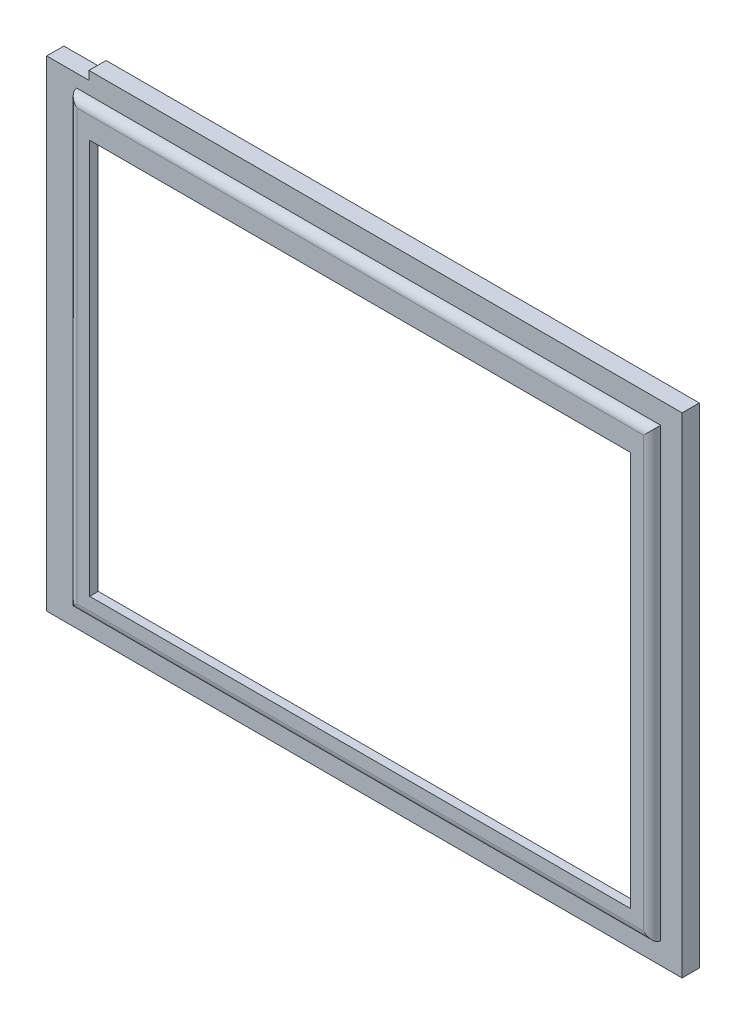
ISO-10303-21;
HEADER;
FILE_DESCRIPTION(('STEP AP214'),'2;1');
FILE_NAME('part.step','',(''),(''),'','','');
FILE_SCHEMA(('AUTOMOTIVE_DESIGN { 1 0 10303 214 1 1 1 1 }'));
ENDSEC;
DATA;
#1=APPLICATION_CONTEXT('core data for automotive mechanical design processes');
#2=APPLICATION_PROTOCOL_DEFINITION('international standard','automotive_design',2000,#1);
#3=PRODUCT_CONTEXT('',#1,'mechanical');
#4=PRODUCT('Part','Part','',(#3));
#5=PRODUCT_RELATED_PRODUCT_CATEGORY('part','',(#4));
#6=PRODUCT_DEFINITION_FORMATION('','',#4);
#7=PRODUCT_DEFINITION_CONTEXT('part definition',#1,'design');
#8=PRODUCT_DEFINITION('design','',#6,#7);
#9=PRODUCT_DEFINITION_SHAPE('','',#8);
#10=(LENGTH_UNIT() NAMED_UNIT(*) SI_UNIT(.MILLI.,.METRE.));
#11=(NAMED_UNIT(*) PLANE_ANGLE_UNIT() SI_UNIT($,.RADIAN.));
#12=(NAMED_UNIT(*) SI_UNIT($,.STERADIAN.) SOLID_ANGLE_UNIT());
#13=UNCERTAINTY_MEASURE_WITH_UNIT(LENGTH_MEASURE(1.E-05),#10,'distance_accuracy_value','');
#14=(GEOMETRIC_REPRESENTATION_CONTEXT(3) GLOBAL_UNCERTAINTY_ASSIGNED_CONTEXT((#13)) GLOBAL_UNIT_ASSIGNED_CONTEXT((#10,
#11,#12)) REPRESENTATION_CONTEXT('',''));
#15=CARTESIAN_POINT('',(0.,0.,0.));
#16=DIRECTION('',(0.,0.,1.));
#17=DIRECTION('',(1.,0.,0.));
#18=AXIS2_PLACEMENT_3D('',#15,#16,#17);
#19=CARTESIAN_POINT('',(0.,-535.,20.));
#20=DIRECTION('',(-1.,0.,0.));
#21=DIRECTION('',(0.,0.,1.));
#22=AXIS2_PLACEMENT_3D('',#19,#20,#21);
#23=CYLINDRICAL_SURFACE('',#22,10.);
#24=CARTESIAN_POINT('',(705.,-535.,20.));
#25=DIRECTION('',(-0.707106781186547,-0.707106781186548,0.));
#26=DIRECTION('',(0.707106781186548,-0.707106781186547,0.));
#27=AXIS2_PLACEMENT_3D('',#24,#25,#26);
#28=ELLIPSE('',#27,14.142135623731,10.);
#29=CARTESIAN_POINT('',(705.,-535.,30.));
#30=VERTEX_POINT('',#29);
#31=CARTESIAN_POINT('',(715.,-545.,20.));
#32=VERTEX_POINT('',#31);
#33=EDGE_CURVE('E12',#30,#32,#28,.F.);
#34=ORIENTED_EDGE('',*,*,#33,.F.);
#35=DIRECTION('',(1.,0.,0.));
#36=VECTOR('',#35,1.);
#37=CARTESIAN_POINT('',(0.,-535.,30.));
#38=LINE('',#37,#36);
#39=CARTESIAN_POINT('',(45.0000000000001,-535.,30.));
#40=VERTEX_POINT('',#39);
#41=EDGE_CURVE('E161',#40,#30,#38,.T.);
#42=ORIENTED_EDGE('',*,*,#41,.F.);
#43=CARTESIAN_POINT('',(45.0000000000001,-535.,20.));
#44=DIRECTION('',(-0.707106781186548,0.707106781186547,0.));
#45=DIRECTION('',(-0.707106781186547,-0.707106781186548,0.));
#46=AXIS2_PLACEMENT_3D('',#43,#44,#45);
#47=ELLIPSE('',#46,14.1421356237309,10.);
#48=CARTESIAN_POINT('',(35.0000000000001,-545.,20.));
#49=VERTEX_POINT('',#48);
#50=EDGE_CURVE('E51',#40,#49,#47,.F.);
#51=ORIENTED_EDGE('',*,*,#50,.T.);
#52=DIRECTION('',(1.,0.,0.));
#53=VECTOR('',#52,1.);
#54=CARTESIAN_POINT('',(35.0000000000001,-545.,20.));
#55=LINE('',#54,#53);
#56=EDGE_CURVE('E154',#49,#32,#55,.T.);
#57=ORIENTED_EDGE('',*,*,#56,.T.);
#58=EDGE_LOOP('',(#34,#42,#51,#57));
#59=FACE_BOUND('',#58,.T.);
#60=ADVANCED_FACE('F44',(#59),#23,.T.);
#61=CARTESIAN_POINT('',(45.,0.,20.));
#62=DIRECTION('',(0.,1.,0.));
#63=DIRECTION('',(-1.,0.,0.));
#64=AXIS2_PLACEMENT_3D('',#61,#62,#63);
#65=CYLINDRICAL_SURFACE('',#64,10.);
#66=ORIENTED_EDGE('',*,*,#50,.F.);
#67=DIRECTION('',(0.,-1.,0.));
#68=VECTOR('',#67,1.);
#69=CARTESIAN_POINT('',(45.,0.,30.));
#70=LINE('',#69,#68);
#71=CARTESIAN_POINT('',(45.,-35.,30.));
#72=VERTEX_POINT('',#71);
#73=EDGE_CURVE('E164',#72,#40,#70,.T.);
#74=ORIENTED_EDGE('',*,*,#73,.F.);
#75=CARTESIAN_POINT('',(45.,-35.,20.));
#76=DIRECTION('',(0.707106781186547,0.707106781186548,0.));
#77=DIRECTION('',(-0.707106781186548,0.707106781186547,0.));
#78=AXIS2_PLACEMENT_3D('',#75,#76,#77);
#79=ELLIPSE('',#78,14.142135623731,10.);
#80=CARTESIAN_POINT('',(35.,-25.,20.));
#81=VERTEX_POINT('',#80);
#82=EDGE_CURVE('E66',#72,#81,#79,.F.);
#83=ORIENTED_EDGE('',*,*,#82,.T.);
#84=DIRECTION('',(0.,-1.,0.));
#85=VECTOR('',#84,1.);
#86=CARTESIAN_POINT('',(35.,-25.,20.));
#87=LINE('',#86,#85);
#88=EDGE_CURVE('E128',#81,#49,#87,.T.);
#89=ORIENTED_EDGE('',*,*,#88,.T.);
#90=EDGE_LOOP('',(#66,#74,#83,#89));
#91=FACE_BOUND('',#90,.T.);
#92=ADVANCED_FACE('F183',(#91),#65,.T.);
#93=CARTESIAN_POINT('',(0.,-35.,20.));
#94=DIRECTION('',(1.,0.,0.));
#95=DIRECTION('',(0.,1.,0.));
#96=AXIS2_PLACEMENT_3D('',#93,#94,#95);
#97=CYLINDRICAL_SURFACE('',#96,10.);
#98=ORIENTED_EDGE('',*,*,#82,.F.);
#99=DIRECTION('',(-1.,0.,0.));
#100=VECTOR('',#99,1.);
#101=CARTESIAN_POINT('',(0.,-35.,30.));
#102=LINE('',#101,#100);
#103=CARTESIAN_POINT('',(705.,-35.,30.));
#104=VERTEX_POINT('',#103);
#105=EDGE_CURVE('E167',#104,#72,#102,.T.);
#106=ORIENTED_EDGE('',*,*,#105,.F.);
#107=CARTESIAN_POINT('',(705.,-35.,20.));
#108=DIRECTION('',(0.707106781186548,-0.707106781186547,0.));
#109=DIRECTION('',(0.707106781186547,0.707106781186548,0.));
#110=AXIS2_PLACEMENT_3D('',#107,#108,#109);
#111=ELLIPSE('',#110,14.1421356237309,10.);
#112=CARTESIAN_POINT('',(715.,-25.,20.));
#113=VERTEX_POINT('',#112);
#114=EDGE_CURVE('E58',#104,#113,#111,.F.);
#115=ORIENTED_EDGE('',*,*,#114,.T.);
#116=DIRECTION('',(-1.,0.,0.));
#117=VECTOR('',#116,1.);
#118=CARTESIAN_POINT('',(35.,-25.,20.));
#119=LINE('',#118,#117);
#120=EDGE_CURVE('E159',#113,#81,#119,.T.);
#121=ORIENTED_EDGE('',*,*,#120,.T.);
#122=EDGE_LOOP('',(#98,#106,#115,#121));
#123=FACE_BOUND('',#122,.T.);
#124=ADVANCED_FACE('F184',(#123),#97,.T.);
#125=CARTESIAN_POINT('',(705.,1.50520621607834E-13,20.));
#126=DIRECTION('',(0.,-1.,0.));
#127=DIRECTION('',(1.,0.,0.));
#128=AXIS2_PLACEMENT_3D('',#125,#126,#127);
#129=CYLINDRICAL_SURFACE('',#128,10.);
#130=DIRECTION('',(0.,1.,0.));
#131=VECTOR('',#130,1.);
#132=CARTESIAN_POINT('',(705.,1.50520621607834E-13,30.));
#133=LINE('',#132,#131);
#134=EDGE_CURVE('E169',#30,#104,#133,.T.);
#135=ORIENTED_EDGE('',*,*,#134,.F.);
#136=ORIENTED_EDGE('',*,*,#33,.T.);
#137=DIRECTION('',(0.,1.,0.));
#138=VECTOR('',#137,1.);
#139=CARTESIAN_POINT('',(715.,-25.,20.));
#140=LINE('',#139,#138);
#141=EDGE_CURVE('E157',#32,#113,#140,.T.);
#142=ORIENTED_EDGE('',*,*,#141,.T.);
#143=ORIENTED_EDGE('',*,*,#114,.F.);
#144=EDGE_LOOP('',(#135,#136,#142,#143));
#145=FACE_BOUND('',#144,.T.);
#146=ADVANCED_FACE('F185',(#145),#129,.T.);
#147=CARTESIAN_POINT('',(0.,0.,30.));
#148=DIRECTION('',(0.,0.,1.));
#149=DIRECTION('',(1.,0.,0.));
#150=AXIS2_PLACEMENT_3D('',#147,#148,#149);
#151=PLANE('',#150);
#152=ORIENTED_EDGE('',*,*,#41,.T.);
#153=ORIENTED_EDGE('',*,*,#134,.T.);
#154=ORIENTED_EDGE('',*,*,#105,.T.);
#155=ORIENTED_EDGE('',*,*,#73,.T.);
#156=EDGE_LOOP('',(#152,#153,#154,#155));
#157=FACE_BOUND('',#156,.T.);
#158=DIRECTION('',(1.,0.,0.));
#159=VECTOR('',#158,1.);
#160=CARTESIAN_POINT('',(60.0000000000001,-520.,30.));
#161=LINE('',#160,#159);
#162=CARTESIAN_POINT('',(60.0000000000001,-520.,30.));
#163=VERTEX_POINT('',#162);
#164=CARTESIAN_POINT('',(690.,-520.,30.));
#165=VERTEX_POINT('',#164);
#166=EDGE_CURVE('E120',#163,#165,#161,.T.);
#167=ORIENTED_EDGE('',*,*,#166,.F.);
#168=DIRECTION('',(0.,-1.,0.));
#169=VECTOR('',#168,1.);
#170=CARTESIAN_POINT('',(60.0000000000001,-520.,30.));
#171=LINE('',#170,#169);
#172=CARTESIAN_POINT('',(60.0000000000001,-60.,30.));
#173=VERTEX_POINT('',#172);
#174=EDGE_CURVE('E110',#173,#163,#171,.T.);
#175=ORIENTED_EDGE('',*,*,#174,.F.);
#176=DIRECTION('',(-1.,0.,0.));
#177=VECTOR('',#176,1.);
#178=CARTESIAN_POINT('',(60.0000000000001,-60.,30.));
#179=LINE('',#178,#177);
#180=CARTESIAN_POINT('',(690.,-60.,30.));
#181=VERTEX_POINT('',#180);
#182=EDGE_CURVE('E136',#181,#173,#179,.T.);
#183=ORIENTED_EDGE('',*,*,#182,.F.);
#184=DIRECTION('',(0.,1.,0.));
#185=VECTOR('',#184,1.);
#186=CARTESIAN_POINT('',(690.,-520.,30.));
#187=LINE('',#186,#185);
#188=EDGE_CURVE('E134',#165,#181,#187,.T.);
#189=ORIENTED_EDGE('',*,*,#188,.F.);
#190=EDGE_LOOP('',(#167,#175,#183,#189));
#191=FACE_BOUND('',#190,.T.);
#192=ADVANCED_FACE('F132',(#157,#191),#151,.T.);
#193=CARTESIAN_POINT('',(0.,0.,20.));
#194=DIRECTION('',(0.,0.,1.));
#195=DIRECTION('',(1.,0.,0.));
#196=AXIS2_PLACEMENT_3D('',#193,#194,#195);
#197=PLANE('',#196);
#198=ORIENTED_EDGE('',*,*,#88,.F.);
#199=ORIENTED_EDGE('',*,*,#120,.F.);
#200=ORIENTED_EDGE('',*,*,#141,.F.);
#201=ORIENTED_EDGE('',*,*,#56,.F.);
#202=EDGE_LOOP('',(#198,#199,#200,#201));
#203=FACE_BOUND('',#202,.T.);
#204=DIRECTION('',(0.,-1.,0.));
#205=VECTOR('',#204,1.);
#206=CARTESIAN_POINT('',(60.0000000000001,-520.,20.));
#207=LINE('',#206,#205);
#208=CARTESIAN_POINT('',(60.0000000000001,-60.,20.));
#209=VERTEX_POINT('',#208);
#210=CARTESIAN_POINT('',(60.0000000000001,-520.,20.));
#211=VERTEX_POINT('',#210);
#212=EDGE_CURVE('E140',#209,#211,#207,.T.);
#213=ORIENTED_EDGE('',*,*,#212,.T.);
#214=DIRECTION('',(1.,0.,0.));
#215=VECTOR('',#214,1.);
#216=CARTESIAN_POINT('',(60.0000000000001,-520.,20.));
#217=LINE('',#216,#215);
#218=CARTESIAN_POINT('',(690.,-520.,20.));
#219=VERTEX_POINT('',#218);
#220=EDGE_CURVE('E127',#211,#219,#217,.T.);
#221=ORIENTED_EDGE('',*,*,#220,.T.);
#222=DIRECTION('',(0.,1.,0.));
#223=VECTOR('',#222,1.);
#224=CARTESIAN_POINT('',(690.,-520.,20.));
#225=LINE('',#224,#223);
#226=CARTESIAN_POINT('',(690.,-60.,20.));
#227=VERTEX_POINT('',#226);
#228=EDGE_CURVE('E143',#219,#227,#225,.T.);
#229=ORIENTED_EDGE('',*,*,#228,.T.);
#230=DIRECTION('',(-1.,0.,0.));
#231=VECTOR('',#230,1.);
#232=CARTESIAN_POINT('',(60.0000000000001,-60.,20.));
#233=LINE('',#232,#231);
#234=EDGE_CURVE('E121',#227,#209,#233,.T.);
#235=ORIENTED_EDGE('',*,*,#234,.T.);
#236=EDGE_LOOP('',(#213,#221,#229,#235));
#237=FACE_BOUND('',#236,.T.);
#238=ADVANCED_FACE('F180',(#203,#237),#197,.F.);
#239=CARTESIAN_POINT('',(60.0000000000001,-520.,30.));
#240=DIRECTION('',(1.,0.,0.));
#241=DIRECTION('',(0.,0.,-1.));
#242=AXIS2_PLACEMENT_3D('',#239,#240,#241);
#243=PLANE('',#242);
#244=ORIENTED_EDGE('',*,*,#212,.F.);
#245=DIRECTION('',(0.,0.,-1.));
#246=VECTOR('',#245,1.);
#247=CARTESIAN_POINT('',(60.0000000000001,-60.,30.));
#248=LINE('',#247,#246);
#249=EDGE_CURVE('E116',#173,#209,#248,.T.);
#250=ORIENTED_EDGE('',*,*,#249,.F.);
#251=ORIENTED_EDGE('',*,*,#174,.T.);
#252=DIRECTION('',(0.,0.,-1.));
#253=VECTOR('',#252,1.);
#254=CARTESIAN_POINT('',(60.0000000000001,-520.,30.));
#255=LINE('',#254,#253);
#256=EDGE_CURVE('E113',#163,#211,#255,.T.);
#257=ORIENTED_EDGE('',*,*,#256,.T.);
#258=EDGE_LOOP('',(#244,#250,#251,#257));
#259=FACE_BOUND('',#258,.T.);
#260=ADVANCED_FACE('F112',(#259),#243,.T.);
#261=CARTESIAN_POINT('',(60.0000000000001,-520.,30.));
#262=DIRECTION('',(0.,1.,0.));
#263=DIRECTION('',(0.,0.,1.));
#264=AXIS2_PLACEMENT_3D('',#261,#262,#263);
#265=PLANE('',#264);
#266=ORIENTED_EDGE('',*,*,#220,.F.);
#267=ORIENTED_EDGE('',*,*,#256,.F.);
#268=ORIENTED_EDGE('',*,*,#166,.T.);
#269=DIRECTION('',(0.,0.,-1.));
#270=VECTOR('',#269,1.);
#271=CARTESIAN_POINT('',(690.,-520.,30.));
#272=LINE('',#271,#270);
#273=EDGE_CURVE('E129',#165,#219,#272,.T.);
#274=ORIENTED_EDGE('',*,*,#273,.T.);
#275=EDGE_LOOP('',(#266,#267,#268,#274));
#276=FACE_BOUND('',#275,.T.);
#277=ADVANCED_FACE('F124',(#276),#265,.T.);
#278=CARTESIAN_POINT('',(690.,-520.,30.));
#279=DIRECTION('',(-1.,0.,0.));
#280=DIRECTION('',(0.,-1.,0.));
#281=AXIS2_PLACEMENT_3D('',#278,#279,#280);
#282=PLANE('',#281);
#283=ORIENTED_EDGE('',*,*,#228,.F.);
#284=ORIENTED_EDGE('',*,*,#273,.F.);
#285=ORIENTED_EDGE('',*,*,#188,.T.);
#286=DIRECTION('',(0.,0.,-1.));
#287=VECTOR('',#286,1.);
#288=CARTESIAN_POINT('',(690.,-60.,30.));
#289=LINE('',#288,#287);
#290=EDGE_CURVE('E149',#181,#227,#289,.T.);
#291=ORIENTED_EDGE('',*,*,#290,.T.);
#292=EDGE_LOOP('',(#283,#284,#285,#291));
#293=FACE_BOUND('',#292,.T.);
#294=ADVANCED_FACE('F235',(#293),#282,.T.);
#295=CARTESIAN_POINT('',(60.0000000000001,-60.,30.));
#296=DIRECTION('',(0.,-1.,0.));
#297=DIRECTION('',(1.,0.,0.));
#298=AXIS2_PLACEMENT_3D('',#295,#296,#297);
#299=PLANE('',#298);
#300=ORIENTED_EDGE('',*,*,#234,.F.);
#301=ORIENTED_EDGE('',*,*,#290,.F.);
#302=ORIENTED_EDGE('',*,*,#182,.T.);
#303=ORIENTED_EDGE('',*,*,#249,.T.);
#304=EDGE_LOOP('',(#300,#301,#302,#303));
#305=FACE_BOUND('',#304,.T.);
#306=ADVANCED_FACE('F243',(#305),#299,.T.);
#307=CLOSED_SHELL('',(#60,#92,#124,#146,#192,#238,#260,#277,#294,#306));
#308=MANIFOLD_SOLID_BREP('B2',#307);
#309=CARTESIAN_POINT('',(0.,0.,20.));
#310=DIRECTION('',(0.,0.,1.));
#311=DIRECTION('',(1.,0.,0.));
#312=AXIS2_PLACEMENT_3D('',#309,#310,#311);
#313=PLANE('',#312);
#314=DIRECTION('',(0.,1.,0.));
#315=VECTOR('',#314,1.);
#316=CARTESIAN_POINT('',(49.143238,0.,20.));
#317=LINE('',#316,#315);
#318=CARTESIAN_POINT('',(49.143238,-10.,20.));
#319=VERTEX_POINT('',#318);
#320=CARTESIAN_POINT('',(49.143238,0.,20.));
#321=VERTEX_POINT('',#320);
#322=EDGE_CURVE('E288',#319,#321,#317,.T.);
#323=ORIENTED_EDGE('',*,*,#322,.F.);
#324=DIRECTION('',(1.,0.,0.));
#325=VECTOR('',#324,1.);
#326=CARTESIAN_POINT('',(0.,-10.,20.));
#327=LINE('',#326,#325);
#328=CARTESIAN_POINT('',(0.,-10.,20.));
#329=VERTEX_POINT('',#328);
#330=EDGE_CURVE('E438',#329,#319,#327,.T.);
#331=ORIENTED_EDGE('',*,*,#330,.F.);
#332=DIRECTION('',(0.,-1.,0.));
#333=VECTOR('',#332,1.);
#334=CARTESIAN_POINT('',(0.,0.,20.));
#335=LINE('',#334,#333);
#336=CARTESIAN_POINT('',(0.,-570.,20.));
#337=VERTEX_POINT('',#336);
#338=EDGE_CURVE('E368',#329,#337,#335,.T.);
#339=ORIENTED_EDGE('',*,*,#338,.T.);
#340=DIRECTION('',(1.,0.,0.));
#341=VECTOR('',#340,1.);
#342=CARTESIAN_POINT('',(0.,-570.,20.));
#343=LINE('',#342,#341);
#344=CARTESIAN_POINT('',(740.,-570.,20.));
#345=VERTEX_POINT('',#344);
#346=EDGE_CURVE('E407',#337,#345,#343,.T.);
#347=ORIENTED_EDGE('',*,*,#346,.T.);
#348=DIRECTION('',(0.,1.,0.));
#349=VECTOR('',#348,1.);
#350=CARTESIAN_POINT('',(740.,-570.,20.));
#351=LINE('',#350,#349);
#352=CARTESIAN_POINT('',(740.,0.,20.));
#353=VERTEX_POINT('',#352);
#354=EDGE_CURVE('E397',#345,#353,#351,.T.);
#355=ORIENTED_EDGE('',*,*,#354,.T.);
#356=DIRECTION('',(-1.,0.,0.));
#357=VECTOR('',#356,1.);
#358=CARTESIAN_POINT('',(0.,0.,20.));
#359=LINE('',#358,#357);
#360=EDGE_CURVE('E382',#353,#321,#359,.T.);
#361=ORIENTED_EDGE('',*,*,#360,.T.);
#362=EDGE_LOOP('',(#323,#331,#339,#347,#355,#361));
#363=FACE_BOUND('',#362,.T.);
#364=DIRECTION('',(1.,0.,0.));
#365=VECTOR('',#364,1.);
#366=CARTESIAN_POINT('',(35.0000000000001,-545.,20.));
#367=LINE('',#366,#365);
#368=CARTESIAN_POINT('',(35.0000000000001,-545.,20.));
#369=VERTEX_POINT('',#368);
#370=CARTESIAN_POINT('',(715.,-545.,20.));
#371=VERTEX_POINT('',#370);
#372=EDGE_CURVE('E432',#369,#371,#367,.T.);
#373=ORIENTED_EDGE('',*,*,#372,.F.);
#374=DIRECTION('',(0.,-1.,0.));
#375=VECTOR('',#374,1.);
#376=CARTESIAN_POINT('',(35.,-25.,20.));
#377=LINE('',#376,#375);
#378=CARTESIAN_POINT('',(35.,-25.,20.));
#379=VERTEX_POINT('',#378);
#380=EDGE_CURVE('E420',#379,#369,#377,.T.);
#381=ORIENTED_EDGE('',*,*,#380,.F.);
#382=DIRECTION('',(-1.,0.,0.));
#383=VECTOR('',#382,1.);
#384=CARTESIAN_POINT('',(35.,-25.,20.));
#385=LINE('',#384,#383);
#386=CARTESIAN_POINT('',(715.,-25.,20.));
#387=VERTEX_POINT('',#386);
#388=EDGE_CURVE('E416',#387,#379,#385,.T.);
#389=ORIENTED_EDGE('',*,*,#388,.F.);
#390=DIRECTION('',(0.,1.,0.));
#391=VECTOR('',#390,1.);
#392=CARTESIAN_POINT('',(715.,-25.,20.));
#393=LINE('',#392,#391);
#394=EDGE_CURVE('E430',#371,#387,#393,.T.);
#395=ORIENTED_EDGE('',*,*,#394,.F.);
#396=EDGE_LOOP('',(#373,#381,#389,#395));
#397=FACE_BOUND('',#396,.T.);
#398=ADVANCED_FACE('F273',(#363,#397),#313,.T.);
#399=CARTESIAN_POINT('',(0.,0.,0.));
#400=DIRECTION('',(0.,0.,1.));
#401=DIRECTION('',(1.,0.,0.));
#402=AXIS2_PLACEMENT_3D('',#399,#400,#401);
#403=PLANE('',#402);
#404=DIRECTION('',(-1.,0.,0.));
#405=VECTOR('',#404,1.);
#406=CARTESIAN_POINT('',(0.,-10.,0.));
#407=LINE('',#406,#405);
#408=CARTESIAN_POINT('',(49.143238,-10.,0.));
#409=VERTEX_POINT('',#408);
#410=CARTESIAN_POINT('',(0.,-10.,0.));
#411=VERTEX_POINT('',#410);
#412=EDGE_CURVE('E349',#409,#411,#407,.T.);
#413=ORIENTED_EDGE('',*,*,#412,.F.);
#414=DIRECTION('',(0.,-1.,0.));
#415=VECTOR('',#414,1.);
#416=CARTESIAN_POINT('',(49.143238,0.,0.));
#417=LINE('',#416,#415);
#418=CARTESIAN_POINT('',(49.143238,0.,0.));
#419=VERTEX_POINT('',#418);
#420=EDGE_CURVE('E401',#419,#409,#417,.T.);
#421=ORIENTED_EDGE('',*,*,#420,.F.);
#422=DIRECTION('',(-1.,0.,0.));
#423=VECTOR('',#422,1.);
#424=CARTESIAN_POINT('',(0.,0.,0.));
#425=LINE('',#424,#423);
#426=CARTESIAN_POINT('',(740.,0.,0.));
#427=VERTEX_POINT('',#426);
#428=EDGE_CURVE('E386',#427,#419,#425,.T.);
#429=ORIENTED_EDGE('',*,*,#428,.F.);
#430=DIRECTION('',(0.,1.,0.));
#431=VECTOR('',#430,1.);
#432=CARTESIAN_POINT('',(740.,-570.,0.));
#433=LINE('',#432,#431);
#434=CARTESIAN_POINT('',(740.,-570.,0.));
#435=VERTEX_POINT('',#434);
#436=EDGE_CURVE('E376',#435,#427,#433,.T.);
#437=ORIENTED_EDGE('',*,*,#436,.F.);
#438=DIRECTION('',(1.,0.,0.));
#439=VECTOR('',#438,1.);
#440=CARTESIAN_POINT('',(0.,-570.,0.));
#441=LINE('',#440,#439);
#442=CARTESIAN_POINT('',(0.,-570.,0.));
#443=VERTEX_POINT('',#442);
#444=EDGE_CURVE('E373',#443,#435,#441,.T.);
#445=ORIENTED_EDGE('',*,*,#444,.F.);
#446=DIRECTION('',(0.,-1.,0.));
#447=VECTOR('',#446,1.);
#448=CARTESIAN_POINT('',(0.,0.,0.));
#449=LINE('',#448,#447);
#450=EDGE_CURVE('E366',#411,#443,#449,.T.);
#451=ORIENTED_EDGE('',*,*,#450,.F.);
#452=EDGE_LOOP('',(#413,#421,#429,#437,#445,#451));
#453=FACE_BOUND('',#452,.T.);
#454=DIRECTION('',(0.,-1.,0.));
#455=VECTOR('',#454,1.);
#456=CARTESIAN_POINT('',(35.,-25.,0.));
#457=LINE('',#456,#455);
#458=CARTESIAN_POINT('',(35.,-25.,0.));
#459=VERTEX_POINT('',#458);
#460=CARTESIAN_POINT('',(35.0000000000001,-545.,0.));
#461=VERTEX_POINT('',#460);
#462=EDGE_CURVE('E360',#459,#461,#457,.T.);
#463=ORIENTED_EDGE('',*,*,#462,.T.);
#464=DIRECTION('',(1.,0.,0.));
#465=VECTOR('',#464,1.);
#466=CARTESIAN_POINT('',(35.0000000000001,-545.,0.));
#467=LINE('',#466,#465);
#468=CARTESIAN_POINT('',(715.,-545.,0.));
#469=VERTEX_POINT('',#468);
#470=EDGE_CURVE('E424',#461,#469,#467,.T.);
#471=ORIENTED_EDGE('',*,*,#470,.T.);
#472=DIRECTION('',(0.,1.,0.));
#473=VECTOR('',#472,1.);
#474=CARTESIAN_POINT('',(715.,-25.,0.));
#475=LINE('',#474,#473);
#476=CARTESIAN_POINT('',(715.,-25.,0.));
#477=VERTEX_POINT('',#476);
#478=EDGE_CURVE('E421',#469,#477,#475,.T.);
#479=ORIENTED_EDGE('',*,*,#478,.T.);
#480=DIRECTION('',(-1.,0.,0.));
#481=VECTOR('',#480,1.);
#482=CARTESIAN_POINT('',(35.,-25.,0.));
#483=LINE('',#482,#481);
#484=EDGE_CURVE('E417',#477,#459,#483,.T.);
#485=ORIENTED_EDGE('',*,*,#484,.T.);
#486=EDGE_LOOP('',(#463,#471,#479,#485));
#487=FACE_BOUND('',#486,.T.);
#488=ADVANCED_FACE('F370',(#453,#487),#403,.F.);
#489=CARTESIAN_POINT('',(0.,0.,20.));
#490=DIRECTION('',(1.,0.,0.));
#491=DIRECTION('',(0.,1.,0.));
#492=AXIS2_PLACEMENT_3D('',#489,#490,#491);
#493=PLANE('',#492);
#494=ORIENTED_EDGE('',*,*,#338,.F.);
#495=DIRECTION('',(0.,0.,1.));
#496=VECTOR('',#495,1.);
#497=CARTESIAN_POINT('',(0.,-10.,-0.001000000000001));
#498=LINE('',#497,#496);
#499=EDGE_CURVE('E353',#411,#329,#498,.T.);
#500=ORIENTED_EDGE('',*,*,#499,.F.);
#501=ORIENTED_EDGE('',*,*,#450,.T.);
#502=DIRECTION('',(0.,0.,-1.));
#503=VECTOR('',#502,1.);
#504=CARTESIAN_POINT('',(0.,-570.,20.));
#505=LINE('',#504,#503);
#506=EDGE_CURVE('E42',#337,#443,#505,.T.);
#507=ORIENTED_EDGE('',*,*,#506,.F.);
#508=EDGE_LOOP('',(#494,#500,#501,#507));
#509=FACE_BOUND('',#508,.T.);
#510=ADVANCED_FACE('F275',(#509),#493,.F.);
#511=CARTESIAN_POINT('',(0.,-570.,20.));
#512=DIRECTION('',(0.,1.,0.));
#513=DIRECTION('',(0.,0.,1.));
#514=AXIS2_PLACEMENT_3D('',#511,#512,#513);
#515=PLANE('',#514);
#516=ORIENTED_EDGE('',*,*,#444,.T.);
#517=DIRECTION('',(0.,0.,-1.));
#518=VECTOR('',#517,1.);
#519=CARTESIAN_POINT('',(740.,-570.,20.));
#520=LINE('',#519,#518);
#521=EDGE_CURVE('E281',#345,#435,#520,.T.);
#522=ORIENTED_EDGE('',*,*,#521,.F.);
#523=ORIENTED_EDGE('',*,*,#346,.F.);
#524=ORIENTED_EDGE('',*,*,#506,.T.);
#525=EDGE_LOOP('',(#516,#522,#523,#524));
#526=FACE_BOUND('',#525,.T.);
#527=ADVANCED_FACE('F478',(#526),#515,.F.);
#528=CARTESIAN_POINT('',(740.,-570.,20.));
#529=DIRECTION('',(-1.,0.,0.));
#530=DIRECTION('',(0.,-1.,0.));
#531=AXIS2_PLACEMENT_3D('',#528,#529,#530);
#532=PLANE('',#531);
#533=ORIENTED_EDGE('',*,*,#436,.T.);
#534=DIRECTION('',(0.,0.,-1.));
#535=VECTOR('',#534,1.);
#536=CARTESIAN_POINT('',(740.,0.,20.));
#537=LINE('',#536,#535);
#538=EDGE_CURVE('E389',#353,#427,#537,.T.);
#539=ORIENTED_EDGE('',*,*,#538,.F.);
#540=ORIENTED_EDGE('',*,*,#354,.F.);
#541=ORIENTED_EDGE('',*,*,#521,.T.);
#542=EDGE_LOOP('',(#533,#539,#540,#541));
#543=FACE_BOUND('',#542,.T.);
#544=ADVANCED_FACE('F395',(#543),#532,.F.);
#545=CARTESIAN_POINT('',(0.,0.,20.));
#546=DIRECTION('',(0.,-1.,0.));
#547=DIRECTION('',(0.,0.,-1.));
#548=AXIS2_PLACEMENT_3D('',#545,#546,#547);
#549=PLANE('',#548);
#550=ORIENTED_EDGE('',*,*,#428,.T.);
#551=DIRECTION('',(0.,0.,1.));
#552=VECTOR('',#551,1.);
#553=CARTESIAN_POINT('',(49.143238,0.,-0.001000000000001));
#554=LINE('',#553,#552);
#555=EDGE_CURVE('E361',#419,#321,#554,.T.);
#556=ORIENTED_EDGE('',*,*,#555,.T.);
#557=ORIENTED_EDGE('',*,*,#360,.F.);
#558=ORIENTED_EDGE('',*,*,#538,.T.);
#559=EDGE_LOOP('',(#550,#556,#557,#558));
#560=FACE_BOUND('',#559,.T.);
#561=ADVANCED_FACE('F403',(#560),#549,.F.);
#562=CARTESIAN_POINT('',(35.,-25.,20.));
#563=DIRECTION('',(1.,0.,0.));
#564=DIRECTION('',(0.,1.,0.));
#565=AXIS2_PLACEMENT_3D('',#562,#563,#564);
#566=PLANE('',#565);
#567=ORIENTED_EDGE('',*,*,#462,.F.);
#568=DIRECTION('',(0.,0.,-1.));
#569=VECTOR('',#568,1.);
#570=CARTESIAN_POINT('',(35.,-25.,20.));
#571=LINE('',#570,#569);
#572=EDGE_CURVE('E413',#379,#459,#571,.T.);
#573=ORIENTED_EDGE('',*,*,#572,.F.);
#574=ORIENTED_EDGE('',*,*,#380,.T.);
#575=DIRECTION('',(0.,0.,-1.));
#576=VECTOR('',#575,1.);
#577=CARTESIAN_POINT('',(35.0000000000001,-545.,20.));
#578=LINE('',#577,#576);
#579=EDGE_CURVE('E374',#369,#461,#578,.T.);
#580=ORIENTED_EDGE('',*,*,#579,.T.);
#581=EDGE_LOOP('',(#567,#573,#574,#580));
#582=FACE_BOUND('',#581,.T.);
#583=ADVANCED_FACE('F456',(#582),#566,.T.);
#584=CARTESIAN_POINT('',(35.0000000000001,-545.,20.));
#585=DIRECTION('',(0.,1.,0.));
#586=DIRECTION('',(0.,0.,1.));
#587=AXIS2_PLACEMENT_3D('',#584,#585,#586);
#588=PLANE('',#587);
#589=ORIENTED_EDGE('',*,*,#470,.F.);
#590=ORIENTED_EDGE('',*,*,#579,.F.);
#591=ORIENTED_EDGE('',*,*,#372,.T.);
#592=DIRECTION('',(0.,0.,-1.));
#593=VECTOR('',#592,1.);
#594=CARTESIAN_POINT('',(715.,-545.,20.));
#595=LINE('',#594,#593);
#596=EDGE_CURVE('E379',#371,#469,#595,.T.);
#597=ORIENTED_EDGE('',*,*,#596,.T.);
#598=EDGE_LOOP('',(#589,#590,#591,#597));
#599=FACE_BOUND('',#598,.T.);
#600=ADVANCED_FACE('F451',(#599),#588,.T.);
#601=CARTESIAN_POINT('',(715.,-25.,20.));
#602=DIRECTION('',(-1.,0.,0.));
#603=DIRECTION('',(0.,-1.,0.));
#604=AXIS2_PLACEMENT_3D('',#601,#602,#603);
#605=PLANE('',#604);
#606=ORIENTED_EDGE('',*,*,#478,.F.);
#607=ORIENTED_EDGE('',*,*,#596,.F.);
#608=ORIENTED_EDGE('',*,*,#394,.T.);
#609=DIRECTION('',(0.,0.,-1.));
#610=VECTOR('',#609,1.);
#611=CARTESIAN_POINT('',(715.,-25.,20.));
#612=LINE('',#611,#610);
#613=EDGE_CURVE('E296',#387,#477,#612,.T.);
#614=ORIENTED_EDGE('',*,*,#613,.T.);
#615=EDGE_LOOP('',(#606,#607,#608,#614));
#616=FACE_BOUND('',#615,.T.);
#617=ADVANCED_FACE('F454',(#616),#605,.T.);
#618=CARTESIAN_POINT('',(35.,-25.,20.));
#619=DIRECTION('',(0.,-1.,0.));
#620=DIRECTION('',(0.,0.,-1.));
#621=AXIS2_PLACEMENT_3D('',#618,#619,#620);
#622=PLANE('',#621);
#623=ORIENTED_EDGE('',*,*,#484,.F.);
#624=ORIENTED_EDGE('',*,*,#613,.F.);
#625=ORIENTED_EDGE('',*,*,#388,.T.);
#626=ORIENTED_EDGE('',*,*,#572,.T.);
#627=EDGE_LOOP('',(#623,#624,#625,#626));
#628=FACE_BOUND('',#627,.T.);
#629=ADVANCED_FACE('F458',(#628),#622,.T.);
#630=CARTESIAN_POINT('',(49.143238,0.,-0.001000000000001));
#631=DIRECTION('',(1.,0.,0.));
#632=DIRECTION('',(0.,0.,-1.));
#633=AXIS2_PLACEMENT_3D('',#630,#631,#632);
#634=PLANE('',#633);
#635=ORIENTED_EDGE('',*,*,#420,.T.);
#636=DIRECTION('',(0.,0.,1.));
#637=VECTOR('',#636,1.);
#638=CARTESIAN_POINT('',(49.143238,-10.,-0.001000000000001));
#639=LINE('',#638,#637);
#640=EDGE_CURVE('E355',#409,#319,#639,.T.);
#641=ORIENTED_EDGE('',*,*,#640,.T.);
#642=ORIENTED_EDGE('',*,*,#322,.T.);
#643=ORIENTED_EDGE('',*,*,#555,.F.);
#644=EDGE_LOOP('',(#635,#641,#642,#643));
#645=FACE_BOUND('',#644,.T.);
#646=ADVANCED_FACE('F440',(#645),#634,.F.);
#647=CARTESIAN_POINT('',(0.,-10.,-0.001000000000001));
#648=DIRECTION('',(0.,-1.,0.));
#649=DIRECTION('',(0.,0.,-1.));
#650=AXIS2_PLACEMENT_3D('',#647,#648,#649);
#651=PLANE('',#650);
#652=ORIENTED_EDGE('',*,*,#412,.T.);
#653=ORIENTED_EDGE('',*,*,#499,.T.);
#654=ORIENTED_EDGE('',*,*,#330,.T.);
#655=ORIENTED_EDGE('',*,*,#640,.F.);
#656=EDGE_LOOP('',(#652,#653,#654,#655));
#657=FACE_BOUND('',#656,.T.);
#658=ADVANCED_FACE('F351',(#657),#651,.F.);
#659=CLOSED_SHELL('',(#398,#488,#510,#527,#544,#561,#583,#600,#617,#629,#646,#658));
#660=MANIFOLD_SOLID_BREP('B6',#659);
#661=ADVANCED_BREP_SHAPE_REPRESENTATION('',(#18,#308,#660),#14);
#662=SHAPE_DEFINITION_REPRESENTATION(#9,#661);
ENDSEC;
END-ISO-10303-21;
